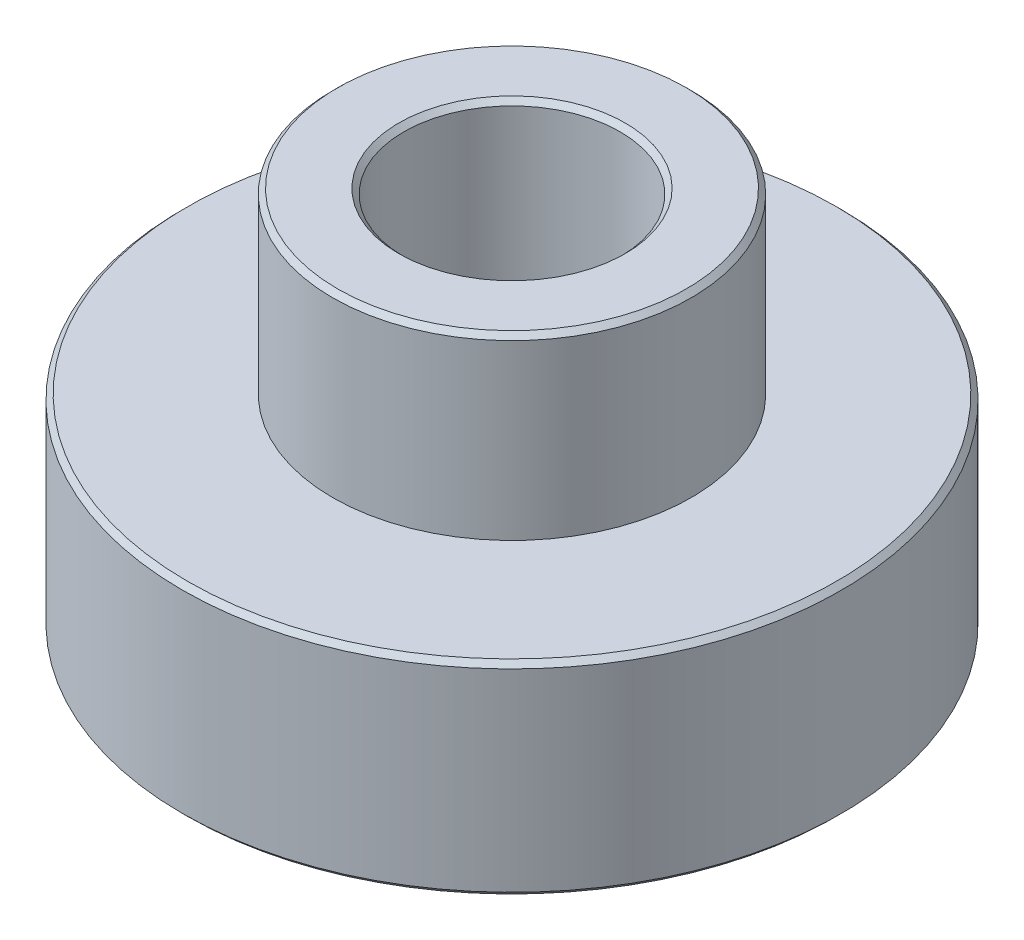
ISO-10303-21;
HEADER;
FILE_DESCRIPTION(('STEP AP214'),'2;1');
FILE_NAME('part.step','',(''),(''),'','','');
FILE_SCHEMA(('AUTOMOTIVE_DESIGN { 1 0 10303 214 1 1 1 1 }'));
ENDSEC;
DATA;
#1=APPLICATION_CONTEXT('core data for automotive mechanical design processes');
#2=APPLICATION_PROTOCOL_DEFINITION('international standard','automotive_design',2000,#1);
#3=PRODUCT_CONTEXT('',#1,'mechanical');
#4=PRODUCT('Part','Part','',(#3));
#5=PRODUCT_RELATED_PRODUCT_CATEGORY('part','',(#4));
#6=PRODUCT_DEFINITION_FORMATION('','',#4);
#7=PRODUCT_DEFINITION_CONTEXT('part definition',#1,'design');
#8=PRODUCT_DEFINITION('design','',#6,#7);
#9=PRODUCT_DEFINITION_SHAPE('','',#8);
#10=(LENGTH_UNIT() NAMED_UNIT(*) SI_UNIT(.MILLI.,.METRE.));
#11=(NAMED_UNIT(*) PLANE_ANGLE_UNIT() SI_UNIT($,.RADIAN.));
#12=(NAMED_UNIT(*) SI_UNIT($,.STERADIAN.) SOLID_ANGLE_UNIT());
#13=UNCERTAINTY_MEASURE_WITH_UNIT(LENGTH_MEASURE(1.E-05),#10,'distance_accuracy_value','');
#14=(GEOMETRIC_REPRESENTATION_CONTEXT(3) GLOBAL_UNCERTAINTY_ASSIGNED_CONTEXT((#13)) GLOBAL_UNIT_ASSIGNED_CONTEXT((#10,
#11,#12)) REPRESENTATION_CONTEXT('',''));
#15=CARTESIAN_POINT('',(0.,0.,0.));
#16=DIRECTION('',(0.,0.,1.));
#17=DIRECTION('',(1.,0.,0.));
#18=AXIS2_PLACEMENT_3D('',#15,#16,#17);
#19=CARTESIAN_POINT('',(0.,8.,0.));
#20=DIRECTION('',(0.,-1.,0.));
#21=DIRECTION('',(0.,0.,-1.));
#22=AXIS2_PLACEMENT_3D('',#19,#20,#21);
#23=CYLINDRICAL_SURFACE('',#22,12.95);
#24=CARTESIAN_POINT('',(0.,7.8,0.));
#25=DIRECTION('',(0.,1.,0.));
#26=DIRECTION('',(0.,0.,1.));
#27=AXIS2_PLACEMENT_3D('',#24,#25,#26);
#28=CIRCLE('',#27,12.95);
#29=CARTESIAN_POINT('',(0.,7.8,12.95));
#30=VERTEX_POINT('',#29);
#31=EDGE_CURVE('E10',#30,#30,#28,.F.);
#32=ORIENTED_EDGE('',*,*,#31,.T.);
#33=EDGE_LOOP('',(#32));
#34=FACE_BOUND('',#33,.T.);
#35=CARTESIAN_POINT('',(0.,0.200000000000002,0.));
#36=DIRECTION('',(0.,1.,0.));
#37=DIRECTION('',(0.,0.,1.));
#38=AXIS2_PLACEMENT_3D('',#35,#36,#37);
#39=CIRCLE('',#38,12.95);
#40=CARTESIAN_POINT('',(0.,0.200000000000002,12.95));
#41=VERTEX_POINT('',#40);
#42=EDGE_CURVE('E47',#41,#41,#39,.T.);
#43=ORIENTED_EDGE('',*,*,#42,.T.);
#44=EDGE_LOOP('',(#43));
#45=FACE_BOUND('',#44,.T.);
#46=ADVANCED_FACE('F39',(#34,#45),#23,.T.);
#47=CARTESIAN_POINT('',(0.,8.,0.));
#48=DIRECTION('',(0.,1.,0.));
#49=DIRECTION('',(0.,0.,1.));
#50=AXIS2_PLACEMENT_3D('',#47,#48,#49);
#51=PLANE('',#50);
#52=CARTESIAN_POINT('',(0.,8.,0.));
#53=DIRECTION('',(0.,1.,0.));
#54=DIRECTION('',(0.,0.,1.));
#55=AXIS2_PLACEMENT_3D('',#52,#53,#54);
#56=CIRCLE('',#55,12.75);
#57=CARTESIAN_POINT('',(0.,8.,12.75));
#58=VERTEX_POINT('',#57);
#59=EDGE_CURVE('E51',#58,#58,#56,.T.);
#60=ORIENTED_EDGE('',*,*,#59,.T.);
#61=EDGE_LOOP('',(#60));
#62=FACE_BOUND('',#61,.T.);
#63=CARTESIAN_POINT('',(0.,8.,0.));
#64=DIRECTION('',(0.,1.,0.));
#65=DIRECTION('',(0.,0.,1.));
#66=AXIS2_PLACEMENT_3D('',#63,#64,#65);
#67=CIRCLE('',#66,7.05);
#68=CARTESIAN_POINT('',(0.,8.,7.05));
#69=VERTEX_POINT('',#68);
#70=EDGE_CURVE('E78',#69,#69,#67,.T.);
#71=ORIENTED_EDGE('',*,*,#70,.F.);
#72=EDGE_LOOP('',(#71));
#73=FACE_BOUND('',#72,.T.);
#74=ADVANCED_FACE('F84',(#62,#73),#51,.T.);
#75=CARTESIAN_POINT('',(0.,0.,0.));
#76=DIRECTION('',(0.,1.,0.));
#77=DIRECTION('',(0.,0.,1.));
#78=AXIS2_PLACEMENT_3D('',#75,#76,#77);
#79=PLANE('',#78);
#80=CARTESIAN_POINT('',(0.,0.,0.));
#81=DIRECTION('',(0.,1.,0.));
#82=DIRECTION('',(0.,0.,1.));
#83=AXIS2_PLACEMENT_3D('',#80,#81,#82);
#84=CIRCLE('',#83,4.45);
#85=CARTESIAN_POINT('',(0.,0.,4.45));
#86=VERTEX_POINT('',#85);
#87=EDGE_CURVE('E66',#86,#86,#84,.T.);
#88=ORIENTED_EDGE('',*,*,#87,.T.);
#89=EDGE_LOOP('',(#88));
#90=FACE_BOUND('',#89,.T.);
#91=CARTESIAN_POINT('',(0.,0.,0.));
#92=DIRECTION('',(0.,1.,0.));
#93=DIRECTION('',(0.,0.,1.));
#94=AXIS2_PLACEMENT_3D('',#91,#92,#93);
#95=CIRCLE('',#94,12.75);
#96=CARTESIAN_POINT('',(0.,0.,12.75));
#97=VERTEX_POINT('',#96);
#98=EDGE_CURVE('E69',#97,#97,#95,.F.);
#99=ORIENTED_EDGE('',*,*,#98,.T.);
#100=EDGE_LOOP('',(#99));
#101=FACE_BOUND('',#100,.T.);
#102=ADVANCED_FACE('F86',(#90,#101),#79,.F.);
#103=CARTESIAN_POINT('',(0.,15.,0.));
#104=DIRECTION('',(0.,-1.,0.));
#105=DIRECTION('',(0.,0.,-1.));
#106=AXIS2_PLACEMENT_3D('',#103,#104,#105);
#107=CYLINDRICAL_SURFACE('',#106,7.05);
#108=CARTESIAN_POINT('',(0.,14.8,0.));
#109=DIRECTION('',(0.,1.,0.));
#110=DIRECTION('',(0.,0.,1.));
#111=AXIS2_PLACEMENT_3D('',#108,#109,#110);
#112=CIRCLE('',#111,7.05);
#113=CARTESIAN_POINT('',(0.,14.8,7.05));
#114=VERTEX_POINT('',#113);
#115=EDGE_CURVE('E55',#114,#114,#112,.F.);
#116=ORIENTED_EDGE('',*,*,#115,.T.);
#117=EDGE_LOOP('',(#116));
#118=FACE_BOUND('',#117,.T.);
#119=ORIENTED_EDGE('',*,*,#70,.T.);
#120=EDGE_LOOP('',(#119));
#121=FACE_BOUND('',#120,.T.);
#122=ADVANCED_FACE('F82',(#118,#121),#107,.T.);
#123=CARTESIAN_POINT('',(0.,15.,0.));
#124=DIRECTION('',(0.,1.,0.));
#125=DIRECTION('',(0.,0.,1.));
#126=AXIS2_PLACEMENT_3D('',#123,#124,#125);
#127=PLANE('',#126);
#128=CARTESIAN_POINT('',(0.,15.,0.));
#129=DIRECTION('',(0.,1.,0.));
#130=DIRECTION('',(0.,0.,1.));
#131=AXIS2_PLACEMENT_3D('',#128,#129,#130);
#132=CIRCLE('',#131,4.45);
#133=CARTESIAN_POINT('',(0.,15.,4.45));
#134=VERTEX_POINT('',#133);
#135=EDGE_CURVE('E60',#134,#134,#132,.F.);
#136=ORIENTED_EDGE('',*,*,#135,.T.);
#137=EDGE_LOOP('',(#136));
#138=FACE_BOUND('',#137,.T.);
#139=CARTESIAN_POINT('',(0.,15.,0.));
#140=DIRECTION('',(0.,1.,0.));
#141=DIRECTION('',(0.,0.,1.));
#142=AXIS2_PLACEMENT_3D('',#139,#140,#141);
#143=CIRCLE('',#142,6.85);
#144=CARTESIAN_POINT('',(0.,15.,6.85));
#145=VERTEX_POINT('',#144);
#146=EDGE_CURVE('E63',#145,#145,#143,.T.);
#147=ORIENTED_EDGE('',*,*,#146,.T.);
#148=EDGE_LOOP('',(#147));
#149=FACE_BOUND('',#148,.T.);
#150=ADVANCED_FACE('F169',(#138,#149),#127,.T.);
#151=CARTESIAN_POINT('',(0.,15.,0.));
#152=DIRECTION('',(0.,-1.,0.));
#153=DIRECTION('',(0.,0.,-1.));
#154=AXIS2_PLACEMENT_3D('',#151,#152,#153);
#155=CYLINDRICAL_SURFACE('',#154,4.25);
#156=CARTESIAN_POINT('',(0.,0.200000000000002,0.));
#157=DIRECTION('',(0.,1.,0.));
#158=DIRECTION('',(0.,0.,1.));
#159=AXIS2_PLACEMENT_3D('',#156,#157,#158);
#160=CIRCLE('',#159,4.25);
#161=CARTESIAN_POINT('',(0.,0.200000000000002,4.25));
#162=VERTEX_POINT('',#161);
#163=EDGE_CURVE('E72',#162,#162,#160,.F.);
#164=ORIENTED_EDGE('',*,*,#163,.T.);
#165=EDGE_LOOP('',(#164));
#166=FACE_BOUND('',#165,.T.);
#167=CARTESIAN_POINT('',(0.,14.8,0.));
#168=DIRECTION('',(0.,1.,0.));
#169=DIRECTION('',(0.,0.,1.));
#170=AXIS2_PLACEMENT_3D('',#167,#168,#169);
#171=CIRCLE('',#170,4.25);
#172=CARTESIAN_POINT('',(0.,14.8,4.25));
#173=VERTEX_POINT('',#172);
#174=EDGE_CURVE('E75',#173,#173,#171,.T.);
#175=ORIENTED_EDGE('',*,*,#174,.T.);
#176=EDGE_LOOP('',(#175));
#177=FACE_BOUND('',#176,.T.);
#178=ADVANCED_FACE('F107',(#166,#177),#155,.F.);
#179=CARTESIAN_POINT('',(0.,0.200000000000002,0.));
#180=DIRECTION('',(0.,-1.,0.));
#181=DIRECTION('',(0.,0.,-1.));
#182=AXIS2_PLACEMENT_3D('',#179,#180,#181);
#183=CONICAL_SURFACE('',#182,4.25,0.785398163397448);
#184=ORIENTED_EDGE('',*,*,#87,.F.);
#185=EDGE_LOOP('',(#184));
#186=FACE_BOUND('',#185,.T.);
#187=ORIENTED_EDGE('',*,*,#163,.F.);
#188=EDGE_LOOP('',(#187));
#189=FACE_BOUND('',#188,.T.);
#190=ADVANCED_FACE('F100',(#186,#189),#183,.F.);
#191=CARTESIAN_POINT('',(0.,15.,0.));
#192=DIRECTION('',(0.,1.,0.));
#193=DIRECTION('',(0.,0.,1.));
#194=AXIS2_PLACEMENT_3D('',#191,#192,#193);
#195=CONICAL_SURFACE('',#194,4.45,0.785398163397453);
#196=ORIENTED_EDGE('',*,*,#174,.F.);
#197=EDGE_LOOP('',(#196));
#198=FACE_BOUND('',#197,.T.);
#199=ORIENTED_EDGE('',*,*,#135,.F.);
#200=EDGE_LOOP('',(#199));
#201=FACE_BOUND('',#200,.T.);
#202=ADVANCED_FACE('F106',(#198,#201),#195,.F.);
#203=CARTESIAN_POINT('',(0.,15.,0.));
#204=DIRECTION('',(0.,-1.,0.));
#205=DIRECTION('',(0.,0.,-1.));
#206=AXIS2_PLACEMENT_3D('',#203,#204,#205);
#207=CONICAL_SURFACE('',#206,6.85,0.785398163397455);
#208=ORIENTED_EDGE('',*,*,#115,.F.);
#209=EDGE_LOOP('',(#208));
#210=FACE_BOUND('',#209,.T.);
#211=ORIENTED_EDGE('',*,*,#146,.F.);
#212=EDGE_LOOP('',(#211));
#213=FACE_BOUND('',#212,.T.);
#214=ADVANCED_FACE('F114',(#210,#213),#207,.T.);
#215=CARTESIAN_POINT('',(0.,8.,0.));
#216=DIRECTION('',(0.,-1.,0.));
#217=DIRECTION('',(0.,0.,-1.));
#218=AXIS2_PLACEMENT_3D('',#215,#216,#217);
#219=CONICAL_SURFACE('',#218,12.75,0.785398163397461);
#220=ORIENTED_EDGE('',*,*,#31,.F.);
#221=EDGE_LOOP('',(#220));
#222=FACE_BOUND('',#221,.T.);
#223=ORIENTED_EDGE('',*,*,#59,.F.);
#224=EDGE_LOOP('',(#223));
#225=FACE_BOUND('',#224,.T.);
#226=ADVANCED_FACE('F120',(#222,#225),#219,.T.);
#227=CARTESIAN_POINT('',(0.,0.200000000000002,0.));
#228=DIRECTION('',(0.,1.,0.));
#229=DIRECTION('',(0.,0.,1.));
#230=AXIS2_PLACEMENT_3D('',#227,#228,#229);
#231=CONICAL_SURFACE('',#230,12.95,0.785398163397453);
#232=ORIENTED_EDGE('',*,*,#98,.F.);
#233=EDGE_LOOP('',(#232));
#234=FACE_BOUND('',#233,.T.);
#235=ORIENTED_EDGE('',*,*,#42,.F.);
#236=EDGE_LOOP('',(#235));
#237=FACE_BOUND('',#236,.T.);
#238=ADVANCED_FACE('F42',(#234,#237),#231,.T.);
#239=CLOSED_SHELL('',(#46,#74,#102,#122,#150,#178,#190,#202,#214,#226,#238));
#240=MANIFOLD_SOLID_BREP('B2',#239);
#241=ADVANCED_BREP_SHAPE_REPRESENTATION('',(#18,#240),#14);
#242=SHAPE_DEFINITION_REPRESENTATION(#9,#241);
ENDSEC;
END-ISO-10303-21;
